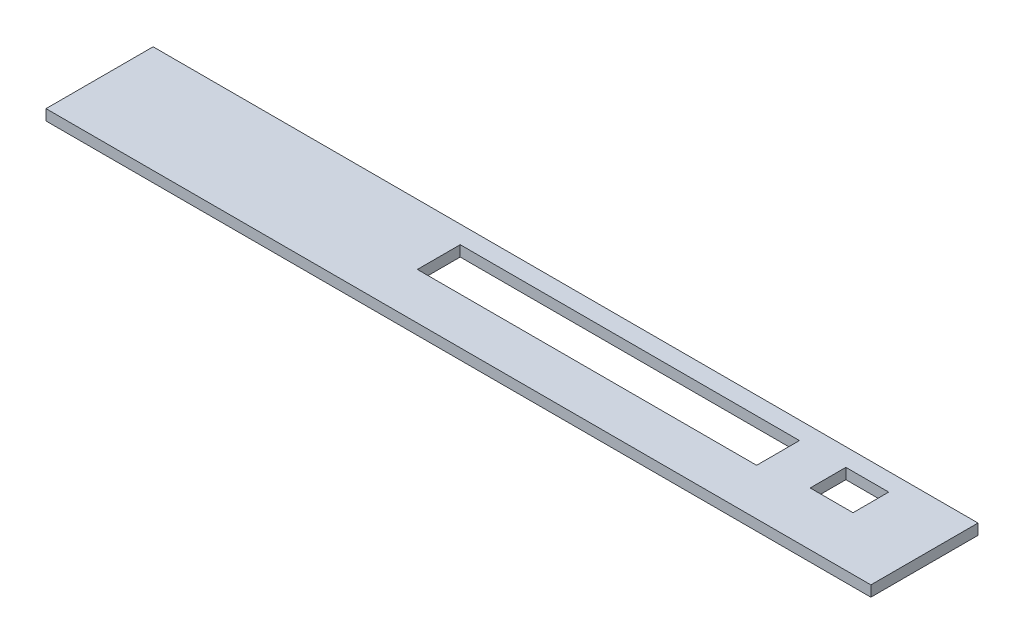
ISO-10303-21;
HEADER;
FILE_DESCRIPTION(('STEP AP214'),'2;1');
FILE_NAME('part.step','',(''),(''),'','','');
FILE_SCHEMA(('AUTOMOTIVE_DESIGN { 1 0 10303 214 1 1 1 1 }'));
ENDSEC;
DATA;
#1=APPLICATION_CONTEXT('core data for automotive mechanical design processes');
#2=APPLICATION_PROTOCOL_DEFINITION('international standard','automotive_design',2000,#1);
#3=PRODUCT_CONTEXT('',#1,'mechanical');
#4=PRODUCT('Part','Part','',(#3));
#5=PRODUCT_RELATED_PRODUCT_CATEGORY('part','',(#4));
#6=PRODUCT_DEFINITION_FORMATION('','',#4);
#7=PRODUCT_DEFINITION_CONTEXT('part definition',#1,'design');
#8=PRODUCT_DEFINITION('design','',#6,#7);
#9=PRODUCT_DEFINITION_SHAPE('','',#8);
#10=(LENGTH_UNIT() NAMED_UNIT(*) SI_UNIT(.MILLI.,.METRE.));
#11=(NAMED_UNIT(*) PLANE_ANGLE_UNIT() SI_UNIT($,.RADIAN.));
#12=(NAMED_UNIT(*) SI_UNIT($,.STERADIAN.) SOLID_ANGLE_UNIT());
#13=UNCERTAINTY_MEASURE_WITH_UNIT(LENGTH_MEASURE(1.E-05),#10,'distance_accuracy_value','');
#14=(GEOMETRIC_REPRESENTATION_CONTEXT(3) GLOBAL_UNCERTAINTY_ASSIGNED_CONTEXT((#13)) GLOBAL_UNIT_ASSIGNED_CONTEXT((#10,
#11,#12)) REPRESENTATION_CONTEXT('',''));
#15=CARTESIAN_POINT('',(0.,0.,0.));
#16=DIRECTION('',(0.,0.,1.));
#17=DIRECTION('',(1.,0.,0.));
#18=AXIS2_PLACEMENT_3D('',#15,#16,#17);
#19=CARTESIAN_POINT('',(0.,3.,-30.));
#20=DIRECTION('',(1.,0.,0.));
#21=DIRECTION('',(0.,0.,-1.));
#22=AXIS2_PLACEMENT_3D('',#19,#20,#21);
#23=PLANE('',#22);
#24=DIRECTION('',(0.,0.,1.));
#25=VECTOR('',#24,1.);
#26=CARTESIAN_POINT('',(0.,0.,-30.));
#27=LINE('',#26,#25);
#28=CARTESIAN_POINT('',(0.,0.,-30.));
#29=VERTEX_POINT('',#28);
#30=CARTESIAN_POINT('',(0.,0.,0.));
#31=VERTEX_POINT('',#30);
#32=EDGE_CURVE('E158',#29,#31,#27,.T.);
#33=ORIENTED_EDGE('',*,*,#32,.T.);
#34=DIRECTION('',(0.,-1.,0.));
#35=VECTOR('',#34,1.);
#36=CARTESIAN_POINT('',(0.,3.,0.));
#37=LINE('',#36,#35);
#38=CARTESIAN_POINT('',(0.,3.,0.));
#39=VERTEX_POINT('',#38);
#40=EDGE_CURVE('E11',#39,#31,#37,.T.);
#41=ORIENTED_EDGE('',*,*,#40,.F.);
#42=DIRECTION('',(0.,0.,1.));
#43=VECTOR('',#42,1.);
#44=CARTESIAN_POINT('',(0.,3.,-30.));
#45=LINE('',#44,#43);
#46=CARTESIAN_POINT('',(0.,3.,-30.));
#47=VERTEX_POINT('',#46);
#48=EDGE_CURVE('E191',#47,#39,#45,.T.);
#49=ORIENTED_EDGE('',*,*,#48,.F.);
#50=DIRECTION('',(0.,-1.,0.));
#51=VECTOR('',#50,1.);
#52=CARTESIAN_POINT('',(0.,3.,-30.));
#53=LINE('',#52,#51);
#54=EDGE_CURVE('E201',#47,#29,#53,.T.);
#55=ORIENTED_EDGE('',*,*,#54,.T.);
#56=EDGE_LOOP('',(#33,#41,#49,#55));
#57=FACE_BOUND('',#56,.T.);
#58=ADVANCED_FACE('F33',(#57),#23,.F.);
#59=CARTESIAN_POINT('',(0.,3.,0.));
#60=DIRECTION('',(0.,0.,-1.));
#61=DIRECTION('',(-1.,0.,0.));
#62=AXIS2_PLACEMENT_3D('',#59,#60,#61);
#63=PLANE('',#62);
#64=DIRECTION('',(1.,0.,0.));
#65=VECTOR('',#64,1.);
#66=CARTESIAN_POINT('',(0.,0.,0.));
#67=LINE('',#66,#65);
#68=CARTESIAN_POINT('',(231.,0.,0.));
#69=VERTEX_POINT('',#68);
#70=EDGE_CURVE('E204',#31,#69,#67,.T.);
#71=ORIENTED_EDGE('',*,*,#70,.T.);
#72=DIRECTION('',(0.,-1.,0.));
#73=VECTOR('',#72,1.);
#74=CARTESIAN_POINT('',(231.,3.,0.));
#75=LINE('',#74,#73);
#76=CARTESIAN_POINT('',(231.,3.,0.));
#77=VERTEX_POINT('',#76);
#78=EDGE_CURVE('E40',#77,#69,#75,.T.);
#79=ORIENTED_EDGE('',*,*,#78,.F.);
#80=DIRECTION('',(1.,0.,0.));
#81=VECTOR('',#80,1.);
#82=CARTESIAN_POINT('',(0.,3.,0.));
#83=LINE('',#82,#81);
#84=EDGE_CURVE('E194',#39,#77,#83,.T.);
#85=ORIENTED_EDGE('',*,*,#84,.F.);
#86=ORIENTED_EDGE('',*,*,#40,.T.);
#87=EDGE_LOOP('',(#71,#79,#85,#86));
#88=FACE_BOUND('',#87,.T.);
#89=ADVANCED_FACE('F233',(#88),#63,.F.);
#90=CARTESIAN_POINT('',(231.,3.,0.));
#91=DIRECTION('',(-1.,0.,0.));
#92=DIRECTION('',(0.,0.,1.));
#93=AXIS2_PLACEMENT_3D('',#90,#91,#92);
#94=PLANE('',#93);
#95=DIRECTION('',(0.,0.,-1.));
#96=VECTOR('',#95,1.);
#97=CARTESIAN_POINT('',(231.,0.,0.));
#98=LINE('',#97,#96);
#99=CARTESIAN_POINT('',(231.,0.,-30.));
#100=VERTEX_POINT('',#99);
#101=EDGE_CURVE('E206',#69,#100,#98,.T.);
#102=ORIENTED_EDGE('',*,*,#101,.T.);
#103=DIRECTION('',(0.,-1.,0.));
#104=VECTOR('',#103,1.);
#105=CARTESIAN_POINT('',(231.,3.,-30.));
#106=LINE('',#105,#104);
#107=CARTESIAN_POINT('',(231.,3.,-30.));
#108=VERTEX_POINT('',#107);
#109=EDGE_CURVE('E211',#108,#100,#106,.T.);
#110=ORIENTED_EDGE('',*,*,#109,.F.);
#111=DIRECTION('',(0.,0.,-1.));
#112=VECTOR('',#111,1.);
#113=CARTESIAN_POINT('',(231.,3.,0.));
#114=LINE('',#113,#112);
#115=EDGE_CURVE('E197',#77,#108,#114,.T.);
#116=ORIENTED_EDGE('',*,*,#115,.F.);
#117=ORIENTED_EDGE('',*,*,#78,.T.);
#118=EDGE_LOOP('',(#102,#110,#116,#117));
#119=FACE_BOUND('',#118,.T.);
#120=ADVANCED_FACE('F218',(#119),#94,.F.);
#121=CARTESIAN_POINT('',(231.,3.,-30.));
#122=DIRECTION('',(0.,0.,1.));
#123=DIRECTION('',(1.,0.,0.));
#124=AXIS2_PLACEMENT_3D('',#121,#122,#123);
#125=PLANE('',#124);
#126=DIRECTION('',(-1.,0.,0.));
#127=VECTOR('',#126,1.);
#128=CARTESIAN_POINT('',(231.,0.,-30.));
#129=LINE('',#128,#127);
#130=EDGE_CURVE('E195',#100,#29,#129,.T.);
#131=ORIENTED_EDGE('',*,*,#130,.T.);
#132=ORIENTED_EDGE('',*,*,#54,.F.);
#133=DIRECTION('',(-1.,0.,0.));
#134=VECTOR('',#133,1.);
#135=CARTESIAN_POINT('',(231.,3.,-30.));
#136=LINE('',#135,#134);
#137=EDGE_CURVE('E199',#108,#47,#136,.T.);
#138=ORIENTED_EDGE('',*,*,#137,.F.);
#139=ORIENTED_EDGE('',*,*,#109,.T.);
#140=EDGE_LOOP('',(#131,#132,#138,#139));
#141=FACE_BOUND('',#140,.T.);
#142=ADVANCED_FACE('F226',(#141),#125,.F.);
#143=CARTESIAN_POINT('',(0.,3.,0.));
#144=DIRECTION('',(0.,1.,0.));
#145=DIRECTION('',(0.,0.,1.));
#146=AXIS2_PLACEMENT_3D('',#143,#144,#145);
#147=PLANE('',#146);
#148=DIRECTION('',(0.,0.,1.));
#149=VECTOR('',#148,1.);
#150=CARTESIAN_POINT('',(91.,3.,-25.));
#151=LINE('',#150,#149);
#152=CARTESIAN_POINT('',(91.,3.,-25.));
#153=VERTEX_POINT('',#152);
#154=CARTESIAN_POINT('',(91.,3.,-13.));
#155=VERTEX_POINT('',#154);
#156=EDGE_CURVE('E47',#153,#155,#151,.T.);
#157=ORIENTED_EDGE('',*,*,#156,.F.);
#158=DIRECTION('',(-1.,0.,0.));
#159=VECTOR('',#158,1.);
#160=CARTESIAN_POINT('',(91.,3.,-25.));
#161=LINE('',#160,#159);
#162=CARTESIAN_POINT('',(186.,3.,-25.));
#163=VERTEX_POINT('',#162);
#164=EDGE_CURVE('E142',#163,#153,#161,.T.);
#165=ORIENTED_EDGE('',*,*,#164,.F.);
#166=DIRECTION('',(0.,0.,-1.));
#167=VECTOR('',#166,1.);
#168=CARTESIAN_POINT('',(186.,3.,-25.));
#169=LINE('',#168,#167);
#170=CARTESIAN_POINT('',(186.,3.,-13.));
#171=VERTEX_POINT('',#170);
#172=EDGE_CURVE('E145',#171,#163,#169,.T.);
#173=ORIENTED_EDGE('',*,*,#172,.F.);
#174=DIRECTION('',(1.,0.,0.));
#175=VECTOR('',#174,1.);
#176=CARTESIAN_POINT('',(91.,3.,-13.));
#177=LINE('',#176,#175);
#178=EDGE_CURVE('E151',#155,#171,#177,.T.);
#179=ORIENTED_EDGE('',*,*,#178,.F.);
#180=EDGE_LOOP('',(#157,#165,#173,#179));
#181=FACE_BOUND('',#180,.T.);
#182=DIRECTION('',(0.,0.,1.));
#183=VECTOR('',#182,1.);
#184=CARTESIAN_POINT('',(199.,3.,-25.));
#185=LINE('',#184,#183);
#186=CARTESIAN_POINT('',(199.,3.,-25.));
#187=VERTEX_POINT('',#186);
#188=CARTESIAN_POINT('',(199.,3.,-15.));
#189=VERTEX_POINT('',#188);
#190=EDGE_CURVE('E55',#187,#189,#185,.T.);
#191=ORIENTED_EDGE('',*,*,#190,.F.);
#192=DIRECTION('',(-1.,0.,0.));
#193=VECTOR('',#192,1.);
#194=CARTESIAN_POINT('',(199.,3.,-25.));
#195=LINE('',#194,#193);
#196=CARTESIAN_POINT('',(211.,3.,-25.));
#197=VERTEX_POINT('',#196);
#198=EDGE_CURVE('E166',#197,#187,#195,.T.);
#199=ORIENTED_EDGE('',*,*,#198,.F.);
#200=DIRECTION('',(0.,0.,-1.));
#201=VECTOR('',#200,1.);
#202=CARTESIAN_POINT('',(211.,3.,-25.));
#203=LINE('',#202,#201);
#204=CARTESIAN_POINT('',(211.,3.,-15.));
#205=VERTEX_POINT('',#204);
#206=EDGE_CURVE('E180',#205,#197,#203,.T.);
#207=ORIENTED_EDGE('',*,*,#206,.F.);
#208=DIRECTION('',(1.,0.,0.));
#209=VECTOR('',#208,1.);
#210=CARTESIAN_POINT('',(199.,3.,-15.));
#211=LINE('',#210,#209);
#212=EDGE_CURVE('E177',#189,#205,#211,.T.);
#213=ORIENTED_EDGE('',*,*,#212,.F.);
#214=EDGE_LOOP('',(#191,#199,#207,#213));
#215=FACE_BOUND('',#214,.T.);
#216=ORIENTED_EDGE('',*,*,#48,.T.);
#217=ORIENTED_EDGE('',*,*,#84,.T.);
#218=ORIENTED_EDGE('',*,*,#115,.T.);
#219=ORIENTED_EDGE('',*,*,#137,.T.);
#220=EDGE_LOOP('',(#216,#217,#218,#219));
#221=FACE_BOUND('',#220,.T.);
#222=ADVANCED_FACE('F232',(#181,#215,#221),#147,.T.);
#223=CARTESIAN_POINT('',(0.,0.,0.));
#224=DIRECTION('',(0.,1.,0.));
#225=DIRECTION('',(0.,0.,1.));
#226=AXIS2_PLACEMENT_3D('',#223,#224,#225);
#227=PLANE('',#226);
#228=DIRECTION('',(-1.,0.,0.));
#229=VECTOR('',#228,1.);
#230=CARTESIAN_POINT('',(91.,0.,-25.));
#231=LINE('',#230,#229);
#232=CARTESIAN_POINT('',(186.,0.,-25.));
#233=VERTEX_POINT('',#232);
#234=CARTESIAN_POINT('',(91.,0.,-25.));
#235=VERTEX_POINT('',#234);
#236=EDGE_CURVE('E129',#233,#235,#231,.T.);
#237=ORIENTED_EDGE('',*,*,#236,.T.);
#238=DIRECTION('',(0.,0.,1.));
#239=VECTOR('',#238,1.);
#240=CARTESIAN_POINT('',(91.,0.,-25.));
#241=LINE('',#240,#239);
#242=CARTESIAN_POINT('',(91.,0.,-13.));
#243=VERTEX_POINT('',#242);
#244=EDGE_CURVE('E123',#235,#243,#241,.T.);
#245=ORIENTED_EDGE('',*,*,#244,.T.);
#246=DIRECTION('',(1.,0.,0.));
#247=VECTOR('',#246,1.);
#248=CARTESIAN_POINT('',(91.,0.,-13.));
#249=LINE('',#248,#247);
#250=CARTESIAN_POINT('',(186.,0.,-13.));
#251=VERTEX_POINT('',#250);
#252=EDGE_CURVE('E133',#243,#251,#249,.T.);
#253=ORIENTED_EDGE('',*,*,#252,.T.);
#254=DIRECTION('',(0.,0.,-1.));
#255=VECTOR('',#254,1.);
#256=CARTESIAN_POINT('',(186.,0.,-25.));
#257=LINE('',#256,#255);
#258=EDGE_CURVE('E137',#251,#233,#257,.T.);
#259=ORIENTED_EDGE('',*,*,#258,.T.);
#260=EDGE_LOOP('',(#237,#245,#253,#259));
#261=FACE_BOUND('',#260,.T.);
#262=DIRECTION('',(-1.,0.,0.));
#263=VECTOR('',#262,1.);
#264=CARTESIAN_POINT('',(199.,0.,-25.));
#265=LINE('',#264,#263);
#266=CARTESIAN_POINT('',(211.,0.,-25.));
#267=VERTEX_POINT('',#266);
#268=CARTESIAN_POINT('',(199.,0.,-25.));
#269=VERTEX_POINT('',#268);
#270=EDGE_CURVE('E172',#267,#269,#265,.T.);
#271=ORIENTED_EDGE('',*,*,#270,.T.);
#272=DIRECTION('',(0.,0.,1.));
#273=VECTOR('',#272,1.);
#274=CARTESIAN_POINT('',(199.,0.,-25.));
#275=LINE('',#274,#273);
#276=CARTESIAN_POINT('',(199.,0.,-15.));
#277=VERTEX_POINT('',#276);
#278=EDGE_CURVE('E162',#269,#277,#275,.T.);
#279=ORIENTED_EDGE('',*,*,#278,.T.);
#280=DIRECTION('',(1.,0.,0.));
#281=VECTOR('',#280,1.);
#282=CARTESIAN_POINT('',(199.,0.,-15.));
#283=LINE('',#282,#281);
#284=CARTESIAN_POINT('',(211.,0.,-15.));
#285=VERTEX_POINT('',#284);
#286=EDGE_CURVE('E165',#277,#285,#283,.T.);
#287=ORIENTED_EDGE('',*,*,#286,.T.);
#288=DIRECTION('',(0.,0.,-1.));
#289=VECTOR('',#288,1.);
#290=CARTESIAN_POINT('',(211.,0.,-25.));
#291=LINE('',#290,#289);
#292=EDGE_CURVE('E169',#285,#267,#291,.T.);
#293=ORIENTED_EDGE('',*,*,#292,.T.);
#294=EDGE_LOOP('',(#271,#279,#287,#293));
#295=FACE_BOUND('',#294,.T.);
#296=ORIENTED_EDGE('',*,*,#32,.F.);
#297=ORIENTED_EDGE('',*,*,#130,.F.);
#298=ORIENTED_EDGE('',*,*,#101,.F.);
#299=ORIENTED_EDGE('',*,*,#70,.F.);
#300=EDGE_LOOP('',(#296,#297,#298,#299));
#301=FACE_BOUND('',#300,.T.);
#302=ADVANCED_FACE('F139',(#261,#295,#301),#227,.F.);
#303=CARTESIAN_POINT('',(199.,0.,-25.));
#304=DIRECTION('',(-1.,0.,0.));
#305=DIRECTION('',(0.,0.,1.));
#306=AXIS2_PLACEMENT_3D('',#303,#304,#305);
#307=PLANE('',#306);
#308=ORIENTED_EDGE('',*,*,#190,.T.);
#309=DIRECTION('',(0.,1.,0.));
#310=VECTOR('',#309,1.);
#311=CARTESIAN_POINT('',(199.,0.,-15.));
#312=LINE('',#311,#310);
#313=EDGE_CURVE('E175',#277,#189,#312,.T.);
#314=ORIENTED_EDGE('',*,*,#313,.F.);
#315=ORIENTED_EDGE('',*,*,#278,.F.);
#316=DIRECTION('',(0.,1.,0.));
#317=VECTOR('',#316,1.);
#318=CARTESIAN_POINT('',(199.,0.,-25.));
#319=LINE('',#318,#317);
#320=EDGE_CURVE('E152',#269,#187,#319,.T.);
#321=ORIENTED_EDGE('',*,*,#320,.T.);
#322=EDGE_LOOP('',(#308,#314,#315,#321));
#323=FACE_BOUND('',#322,.T.);
#324=ADVANCED_FACE('F245',(#323),#307,.F.);
#325=CARTESIAN_POINT('',(199.,0.,-25.));
#326=DIRECTION('',(0.,0.,-1.));
#327=DIRECTION('',(-1.,0.,0.));
#328=AXIS2_PLACEMENT_3D('',#325,#326,#327);
#329=PLANE('',#328);
#330=ORIENTED_EDGE('',*,*,#198,.T.);
#331=ORIENTED_EDGE('',*,*,#320,.F.);
#332=ORIENTED_EDGE('',*,*,#270,.F.);
#333=DIRECTION('',(0.,1.,0.));
#334=VECTOR('',#333,1.);
#335=CARTESIAN_POINT('',(211.,0.,-25.));
#336=LINE('',#335,#334);
#337=EDGE_CURVE('E186',#267,#197,#336,.T.);
#338=ORIENTED_EDGE('',*,*,#337,.T.);
#339=EDGE_LOOP('',(#330,#331,#332,#338));
#340=FACE_BOUND('',#339,.T.);
#341=ADVANCED_FACE('F251',(#340),#329,.F.);
#342=CARTESIAN_POINT('',(211.,0.,-25.));
#343=DIRECTION('',(1.,0.,0.));
#344=DIRECTION('',(0.,0.,-1.));
#345=AXIS2_PLACEMENT_3D('',#342,#343,#344);
#346=PLANE('',#345);
#347=ORIENTED_EDGE('',*,*,#206,.T.);
#348=ORIENTED_EDGE('',*,*,#337,.F.);
#349=ORIENTED_EDGE('',*,*,#292,.F.);
#350=DIRECTION('',(0.,1.,0.));
#351=VECTOR('',#350,1.);
#352=CARTESIAN_POINT('',(211.,0.,-15.));
#353=LINE('',#352,#351);
#354=EDGE_CURVE('E188',#285,#205,#353,.T.);
#355=ORIENTED_EDGE('',*,*,#354,.T.);
#356=EDGE_LOOP('',(#347,#348,#349,#355));
#357=FACE_BOUND('',#356,.T.);
#358=ADVANCED_FACE('F255',(#357),#346,.F.);
#359=CARTESIAN_POINT('',(199.,0.,-15.));
#360=DIRECTION('',(0.,0.,1.));
#361=DIRECTION('',(1.,0.,0.));
#362=AXIS2_PLACEMENT_3D('',#359,#360,#361);
#363=PLANE('',#362);
#364=ORIENTED_EDGE('',*,*,#212,.T.);
#365=ORIENTED_EDGE('',*,*,#354,.F.);
#366=ORIENTED_EDGE('',*,*,#286,.F.);
#367=ORIENTED_EDGE('',*,*,#313,.T.);
#368=EDGE_LOOP('',(#364,#365,#366,#367));
#369=FACE_BOUND('',#368,.T.);
#370=ADVANCED_FACE('F252',(#369),#363,.F.);
#371=CARTESIAN_POINT('',(91.,0.,-25.));
#372=DIRECTION('',(-1.,0.,0.));
#373=DIRECTION('',(0.,0.,1.));
#374=AXIS2_PLACEMENT_3D('',#371,#372,#373);
#375=PLANE('',#374);
#376=ORIENTED_EDGE('',*,*,#156,.T.);
#377=DIRECTION('',(0.,1.,0.));
#378=VECTOR('',#377,1.);
#379=CARTESIAN_POINT('',(91.,0.,-13.));
#380=LINE('',#379,#378);
#381=EDGE_CURVE('E119',#243,#155,#380,.T.);
#382=ORIENTED_EDGE('',*,*,#381,.F.);
#383=ORIENTED_EDGE('',*,*,#244,.F.);
#384=DIRECTION('',(0.,1.,0.));
#385=VECTOR('',#384,1.);
#386=CARTESIAN_POINT('',(91.,0.,-25.));
#387=LINE('',#386,#385);
#388=EDGE_CURVE('E156',#235,#153,#387,.T.);
#389=ORIENTED_EDGE('',*,*,#388,.T.);
#390=EDGE_LOOP('',(#376,#382,#383,#389));
#391=FACE_BOUND('',#390,.T.);
#392=ADVANCED_FACE('F121',(#391),#375,.F.);
#393=CARTESIAN_POINT('',(91.,0.,-25.));
#394=DIRECTION('',(0.,0.,-1.));
#395=DIRECTION('',(-1.,0.,0.));
#396=AXIS2_PLACEMENT_3D('',#393,#394,#395);
#397=PLANE('',#396);
#398=ORIENTED_EDGE('',*,*,#164,.T.);
#399=ORIENTED_EDGE('',*,*,#388,.F.);
#400=ORIENTED_EDGE('',*,*,#236,.F.);
#401=DIRECTION('',(0.,1.,0.));
#402=VECTOR('',#401,1.);
#403=CARTESIAN_POINT('',(186.,0.,-25.));
#404=LINE('',#403,#402);
#405=EDGE_CURVE('E159',#233,#163,#404,.T.);
#406=ORIENTED_EDGE('',*,*,#405,.T.);
#407=EDGE_LOOP('',(#398,#399,#400,#406));
#408=FACE_BOUND('',#407,.T.);
#409=ADVANCED_FACE('F265',(#408),#397,.F.);
#410=CARTESIAN_POINT('',(186.,0.,-25.));
#411=DIRECTION('',(1.,0.,0.));
#412=DIRECTION('',(0.,0.,-1.));
#413=AXIS2_PLACEMENT_3D('',#410,#411,#412);
#414=PLANE('',#413);
#415=ORIENTED_EDGE('',*,*,#172,.T.);
#416=ORIENTED_EDGE('',*,*,#405,.F.);
#417=ORIENTED_EDGE('',*,*,#258,.F.);
#418=DIRECTION('',(0.,1.,0.));
#419=VECTOR('',#418,1.);
#420=CARTESIAN_POINT('',(186.,0.,-13.));
#421=LINE('',#420,#419);
#422=EDGE_CURVE('E128',#251,#171,#421,.T.);
#423=ORIENTED_EDGE('',*,*,#422,.T.);
#424=EDGE_LOOP('',(#415,#416,#417,#423));
#425=FACE_BOUND('',#424,.T.);
#426=ADVANCED_FACE('F268',(#425),#414,.F.);
#427=CARTESIAN_POINT('',(91.,0.,-13.));
#428=DIRECTION('',(0.,0.,1.));
#429=DIRECTION('',(1.,0.,0.));
#430=AXIS2_PLACEMENT_3D('',#427,#428,#429);
#431=PLANE('',#430);
#432=ORIENTED_EDGE('',*,*,#178,.T.);
#433=ORIENTED_EDGE('',*,*,#422,.F.);
#434=ORIENTED_EDGE('',*,*,#252,.F.);
#435=ORIENTED_EDGE('',*,*,#381,.T.);
#436=EDGE_LOOP('',(#432,#433,#434,#435));
#437=FACE_BOUND('',#436,.T.);
#438=ADVANCED_FACE('F134',(#437),#431,.F.);
#439=CLOSED_SHELL('',(#58,#89,#120,#142,#222,#302,#324,#341,#358,#370,#392,#409,#426,#438));
#440=MANIFOLD_SOLID_BREP('B2',#439);
#441=ADVANCED_BREP_SHAPE_REPRESENTATION('',(#18,#440),#14);
#442=SHAPE_DEFINITION_REPRESENTATION(#9,#441);
ENDSEC;
END-ISO-10303-21;
